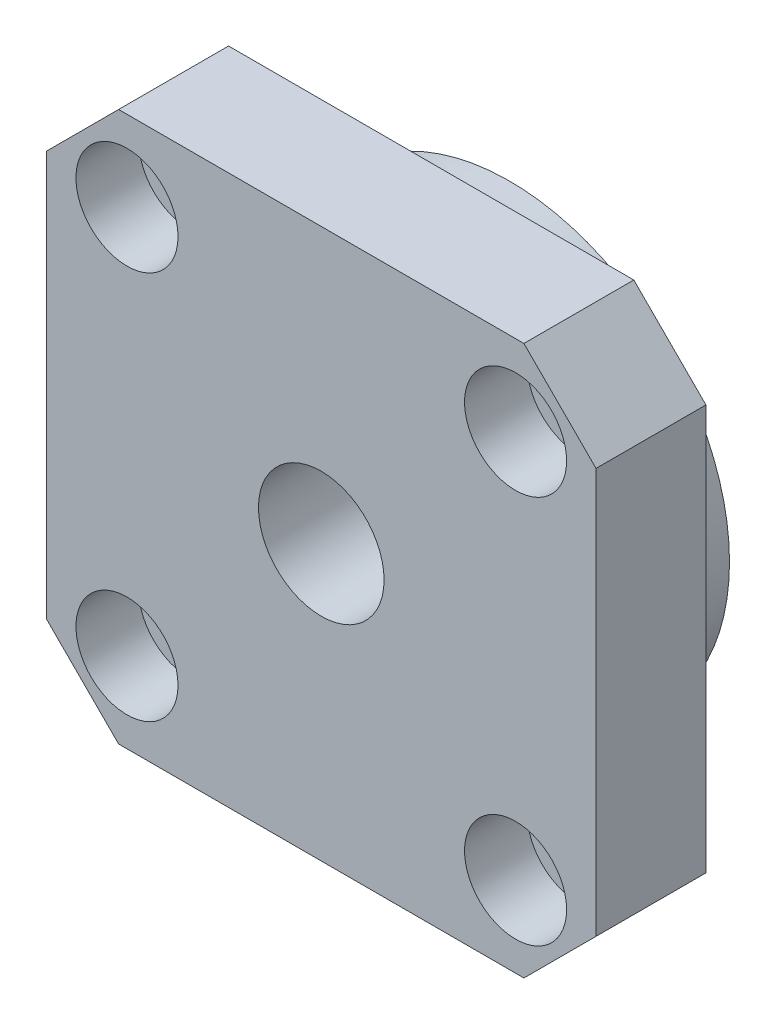
ISO-10303-21;
HEADER;
FILE_DESCRIPTION(('STEP AP214'),'2;1');
FILE_NAME('part.step','',(''),(''),'','','');
FILE_SCHEMA(('AUTOMOTIVE_DESIGN { 1 0 10303 214 1 1 1 1 }'));
ENDSEC;
DATA;
#1=APPLICATION_CONTEXT('core data for automotive mechanical design processes');
#2=APPLICATION_PROTOCOL_DEFINITION('international standard','automotive_design',2000,#1);
#3=PRODUCT_CONTEXT('',#1,'mechanical');
#4=PRODUCT('Part','Part','',(#3));
#5=PRODUCT_RELATED_PRODUCT_CATEGORY('part','',(#4));
#6=PRODUCT_DEFINITION_FORMATION('','',#4);
#7=PRODUCT_DEFINITION_CONTEXT('part definition',#1,'design');
#8=PRODUCT_DEFINITION('design','',#6,#7);
#9=PRODUCT_DEFINITION_SHAPE('','',#8);
#10=(LENGTH_UNIT() NAMED_UNIT(*) SI_UNIT(.MILLI.,.METRE.));
#11=(NAMED_UNIT(*) PLANE_ANGLE_UNIT() SI_UNIT($,.RADIAN.));
#12=(NAMED_UNIT(*) SI_UNIT($,.STERADIAN.) SOLID_ANGLE_UNIT());
#13=UNCERTAINTY_MEASURE_WITH_UNIT(LENGTH_MEASURE(1.E-05),#10,'distance_accuracy_value','');
#14=(GEOMETRIC_REPRESENTATION_CONTEXT(3) GLOBAL_UNCERTAINTY_ASSIGNED_CONTEXT((#13)) GLOBAL_UNIT_ASSIGNED_CONTEXT((#10,
#11,#12)) REPRESENTATION_CONTEXT('',''));
#15=CARTESIAN_POINT('',(0.,0.,0.));
#16=DIRECTION('',(0.,0.,1.));
#17=DIRECTION('',(1.,0.,0.));
#18=AXIS2_PLACEMENT_3D('',#15,#16,#17);
#19=CARTESIAN_POINT('',(0.,0.,5.));
#20=DIRECTION('',(0.,0.,-1.));
#21=DIRECTION('',(-1.,0.,0.));
#22=AXIS2_PLACEMENT_3D('',#19,#20,#21);
#23=CYLINDRICAL_SURFACE('',#22,4.);
#24=CARTESIAN_POINT('',(0.,0.,12.));
#25=DIRECTION('',(0.,0.,1.));
#26=DIRECTION('',(1.,0.,0.));
#27=AXIS2_PLACEMENT_3D('',#24,#25,#26);
#28=CIRCLE('',#27,4.);
#29=CARTESIAN_POINT('',(4.,0.,12.));
#30=VERTEX_POINT('',#29);
#31=EDGE_CURVE('E148',#30,#30,#28,.T.);
#32=ORIENTED_EDGE('',*,*,#31,.T.);
#33=EDGE_LOOP('',(#32));
#34=FACE_BOUND('',#33,.T.);
#35=CARTESIAN_POINT('',(0.,0.,5.));
#36=DIRECTION('',(0.,0.,-1.));
#37=DIRECTION('',(-1.,0.,0.));
#38=AXIS2_PLACEMENT_3D('',#35,#36,#37);
#39=CIRCLE('',#38,4.);
#40=CARTESIAN_POINT('',(-4.,0.,5.));
#41=VERTEX_POINT('',#40);
#42=EDGE_CURVE('E47',#41,#41,#39,.T.);
#43=ORIENTED_EDGE('',*,*,#42,.T.);
#44=EDGE_LOOP('',(#43));
#45=FACE_BOUND('',#44,.T.);
#46=ADVANCED_FACE('F43',(#34,#45),#23,.F.);
#47=CARTESIAN_POINT('',(-12.3743686707646,12.3743686707646,12.));
#48=DIRECTION('',(0.,0.,-1.));
#49=DIRECTION('',(-1.,0.,0.));
#50=AXIS2_PLACEMENT_3D('',#47,#48,#49);
#51=CYLINDRICAL_SURFACE('',#50,1.7);
#52=CARTESIAN_POINT('',(-12.3743686707646,12.3743686707646,5.));
#53=DIRECTION('',(0.,0.,1.));
#54=DIRECTION('',(1.,0.,0.));
#55=AXIS2_PLACEMENT_3D('',#52,#53,#54);
#56=CIRCLE('',#55,1.7);
#57=CARTESIAN_POINT('',(-10.6743686707646,12.3743686707646,5.));
#58=VERTEX_POINT('',#57);
#59=EDGE_CURVE('E204',#58,#58,#56,.T.);
#60=ORIENTED_EDGE('',*,*,#59,.F.);
#61=EDGE_LOOP('',(#60));
#62=FACE_BOUND('',#61,.T.);
#63=CARTESIAN_POINT('',(-12.3743686707646,12.3743686707646,8.));
#64=DIRECTION('',(0.,0.,1.));
#65=DIRECTION('',(1.,0.,0.));
#66=AXIS2_PLACEMENT_3D('',#63,#64,#65);
#67=CIRCLE('',#66,1.7);
#68=CARTESIAN_POINT('',(-10.6743686707646,12.3743686707646,8.));
#69=VERTEX_POINT('',#68);
#70=EDGE_CURVE('E185',#69,#69,#67,.T.);
#71=ORIENTED_EDGE('',*,*,#70,.T.);
#72=EDGE_LOOP('',(#71));
#73=FACE_BOUND('',#72,.T.);
#74=ADVANCED_FACE('F248',(#62,#73),#51,.F.);
#75=CARTESIAN_POINT('',(12.3743686707646,12.3743686707646,12.));
#76=DIRECTION('',(0.,0.,-1.));
#77=DIRECTION('',(-1.,0.,0.));
#78=AXIS2_PLACEMENT_3D('',#75,#76,#77);
#79=CYLINDRICAL_SURFACE('',#78,1.7);
#80=CARTESIAN_POINT('',(12.3743686707646,12.3743686707646,5.));
#81=DIRECTION('',(0.,0.,1.));
#82=DIRECTION('',(1.,0.,0.));
#83=AXIS2_PLACEMENT_3D('',#80,#81,#82);
#84=CIRCLE('',#83,1.7);
#85=CARTESIAN_POINT('',(14.0743686707646,12.3743686707646,5.));
#86=VERTEX_POINT('',#85);
#87=EDGE_CURVE('E196',#86,#86,#84,.T.);
#88=ORIENTED_EDGE('',*,*,#87,.F.);
#89=EDGE_LOOP('',(#88));
#90=FACE_BOUND('',#89,.T.);
#91=CARTESIAN_POINT('',(12.3743686707646,12.3743686707646,8.));
#92=DIRECTION('',(0.,0.,1.));
#93=DIRECTION('',(1.,0.,0.));
#94=AXIS2_PLACEMENT_3D('',#91,#92,#93);
#95=CIRCLE('',#94,1.7);
#96=CARTESIAN_POINT('',(14.0743686707646,12.3743686707646,8.));
#97=VERTEX_POINT('',#96);
#98=EDGE_CURVE('E183',#97,#97,#95,.T.);
#99=ORIENTED_EDGE('',*,*,#98,.T.);
#100=EDGE_LOOP('',(#99));
#101=FACE_BOUND('',#100,.T.);
#102=ADVANCED_FACE('F255',(#90,#101),#79,.F.);
#103=CARTESIAN_POINT('',(12.3743686707646,-12.3743686707646,12.));
#104=DIRECTION('',(0.,0.,-1.));
#105=DIRECTION('',(-1.,0.,0.));
#106=AXIS2_PLACEMENT_3D('',#103,#104,#105);
#107=CYLINDRICAL_SURFACE('',#106,1.7);
#108=CARTESIAN_POINT('',(12.3743686707646,-12.3743686707646,5.));
#109=DIRECTION('',(0.,0.,1.));
#110=DIRECTION('',(1.,0.,0.));
#111=AXIS2_PLACEMENT_3D('',#108,#109,#110);
#112=CIRCLE('',#111,1.7);
#113=CARTESIAN_POINT('',(14.0743686707646,-12.3743686707646,5.));
#114=VERTEX_POINT('',#113);
#115=EDGE_CURVE('E191',#114,#114,#112,.T.);
#116=ORIENTED_EDGE('',*,*,#115,.F.);
#117=EDGE_LOOP('',(#116));
#118=FACE_BOUND('',#117,.T.);
#119=CARTESIAN_POINT('',(12.3743686707646,-12.3743686707646,8.));
#120=DIRECTION('',(0.,0.,1.));
#121=DIRECTION('',(1.,0.,0.));
#122=AXIS2_PLACEMENT_3D('',#119,#120,#121);
#123=CIRCLE('',#122,1.7);
#124=CARTESIAN_POINT('',(14.0743686707646,-12.3743686707646,8.));
#125=VERTEX_POINT('',#124);
#126=EDGE_CURVE('E179',#125,#125,#123,.T.);
#127=ORIENTED_EDGE('',*,*,#126,.T.);
#128=EDGE_LOOP('',(#127));
#129=FACE_BOUND('',#128,.T.);
#130=ADVANCED_FACE('F270',(#118,#129),#107,.F.);
#131=CARTESIAN_POINT('',(-12.3743686707646,-12.3743686707646,12.));
#132=DIRECTION('',(0.,0.,-1.));
#133=DIRECTION('',(-1.,0.,0.));
#134=AXIS2_PLACEMENT_3D('',#131,#132,#133);
#135=CYLINDRICAL_SURFACE('',#134,1.7);
#136=CARTESIAN_POINT('',(-12.3743686707646,-12.3743686707646,5.));
#137=DIRECTION('',(0.,0.,1.));
#138=DIRECTION('',(1.,0.,0.));
#139=AXIS2_PLACEMENT_3D('',#136,#137,#138);
#140=CIRCLE('',#139,1.7);
#141=CARTESIAN_POINT('',(-10.6743686707646,-12.3743686707646,5.));
#142=VERTEX_POINT('',#141);
#143=EDGE_CURVE('E187',#142,#142,#140,.T.);
#144=ORIENTED_EDGE('',*,*,#143,.F.);
#145=EDGE_LOOP('',(#144));
#146=FACE_BOUND('',#145,.T.);
#147=CARTESIAN_POINT('',(-12.3743686707646,-12.3743686707646,8.));
#148=DIRECTION('',(0.,0.,1.));
#149=DIRECTION('',(1.,0.,0.));
#150=AXIS2_PLACEMENT_3D('',#147,#148,#149);
#151=CIRCLE('',#150,1.7);
#152=CARTESIAN_POINT('',(-10.6743686707646,-12.3743686707646,8.));
#153=VERTEX_POINT('',#152);
#154=EDGE_CURVE('E176',#153,#153,#151,.T.);
#155=ORIENTED_EDGE('',*,*,#154,.T.);
#156=EDGE_LOOP('',(#155));
#157=FACE_BOUND('',#156,.T.);
#158=ADVANCED_FACE('F262',(#146,#157),#135,.F.);
#159=CARTESIAN_POINT('',(0.,0.,0.));
#160=DIRECTION('',(0.,0.,1.));
#161=DIRECTION('',(1.,0.,0.));
#162=AXIS2_PLACEMENT_3D('',#159,#160,#161);
#163=PLANE('',#162);
#164=CARTESIAN_POINT('',(0.,0.,0.));
#165=DIRECTION('',(0.,0.,-1.));
#166=DIRECTION('',(-1.,0.,0.));
#167=AXIS2_PLACEMENT_3D('',#164,#165,#166);
#168=CIRCLE('',#167,10.);
#169=CARTESIAN_POINT('',(-10.,0.,0.));
#170=VERTEX_POINT('',#169);
#171=EDGE_CURVE('E276',#170,#170,#168,.T.);
#172=ORIENTED_EDGE('',*,*,#171,.F.);
#173=EDGE_LOOP('',(#172));
#174=FACE_BOUND('',#173,.T.);
#175=CARTESIAN_POINT('',(0.,0.,0.));
#176=DIRECTION('',(0.,0.,1.));
#177=DIRECTION('',(1.,0.,0.));
#178=AXIS2_PLACEMENT_3D('',#175,#176,#177);
#179=CIRCLE('',#178,14.);
#180=CARTESIAN_POINT('',(14.,0.,0.));
#181=VERTEX_POINT('',#180);
#182=EDGE_CURVE('E53',#181,#181,#179,.T.);
#183=ORIENTED_EDGE('',*,*,#182,.F.);
#184=EDGE_LOOP('',(#183));
#185=FACE_BOUND('',#184,.T.);
#186=ADVANCED_FACE('F261',(#174,#185),#163,.F.);
#187=CARTESIAN_POINT('',(0.,0.,5.));
#188=DIRECTION('',(0.,0.,-1.));
#189=DIRECTION('',(-1.,0.,0.));
#190=AXIS2_PLACEMENT_3D('',#187,#188,#189);
#191=CYLINDRICAL_SURFACE('',#190,14.);
#192=CARTESIAN_POINT('',(0.,0.,5.));
#193=DIRECTION('',(0.,0.,1.));
#194=DIRECTION('',(1.,0.,0.));
#195=AXIS2_PLACEMENT_3D('',#192,#193,#194);
#196=CIRCLE('',#195,14.);
#197=CARTESIAN_POINT('',(14.,0.,5.));
#198=VERTEX_POINT('',#197);
#199=EDGE_CURVE('E11',#198,#198,#196,.T.);
#200=ORIENTED_EDGE('',*,*,#199,.F.);
#201=EDGE_LOOP('',(#200));
#202=FACE_BOUND('',#201,.T.);
#203=ORIENTED_EDGE('',*,*,#182,.T.);
#204=EDGE_LOOP('',(#203));
#205=FACE_BOUND('',#204,.T.);
#206=ADVANCED_FACE('F45',(#202,#205),#191,.T.);
#207=CARTESIAN_POINT('',(0.,0.,12.));
#208=DIRECTION('',(0.,0.,-1.));
#209=DIRECTION('',(-1.,0.,0.));
#210=AXIS2_PLACEMENT_3D('',#207,#208,#209);
#211=PLANE('',#210);
#212=CARTESIAN_POINT('',(-12.3743686707646,-12.3743686707646,12.));
#213=DIRECTION('',(0.,0.,1.));
#214=DIRECTION('',(1.,0.,0.));
#215=AXIS2_PLACEMENT_3D('',#212,#213,#214);
#216=CIRCLE('',#215,3.25);
#217=CARTESIAN_POINT('',(-9.12436867076458,-12.3743686707646,12.));
#218=VERTEX_POINT('',#217);
#219=EDGE_CURVE('E297',#218,#218,#216,.T.);
#220=ORIENTED_EDGE('',*,*,#219,.F.);
#221=EDGE_LOOP('',(#220));
#222=FACE_BOUND('',#221,.T.);
#223=CARTESIAN_POINT('',(12.3743686707646,-12.3743686707646,12.));
#224=DIRECTION('',(0.,0.,1.));
#225=DIRECTION('',(1.,0.,0.));
#226=AXIS2_PLACEMENT_3D('',#223,#224,#225);
#227=CIRCLE('',#226,3.25);
#228=CARTESIAN_POINT('',(15.6243686707646,-12.3743686707646,12.));
#229=VERTEX_POINT('',#228);
#230=EDGE_CURVE('E291',#229,#229,#227,.T.);
#231=ORIENTED_EDGE('',*,*,#230,.F.);
#232=EDGE_LOOP('',(#231));
#233=FACE_BOUND('',#232,.T.);
#234=CARTESIAN_POINT('',(12.3743686707646,12.3743686707646,12.));
#235=DIRECTION('',(0.,0.,1.));
#236=DIRECTION('',(1.,0.,0.));
#237=AXIS2_PLACEMENT_3D('',#234,#235,#236);
#238=CIRCLE('',#237,3.25);
#239=CARTESIAN_POINT('',(15.6243686707646,12.3743686707646,12.));
#240=VERTEX_POINT('',#239);
#241=EDGE_CURVE('E285',#240,#240,#238,.T.);
#242=ORIENTED_EDGE('',*,*,#241,.F.);
#243=EDGE_LOOP('',(#242));
#244=FACE_BOUND('',#243,.T.);
#245=CARTESIAN_POINT('',(-12.3743686707646,12.3743686707646,12.));
#246=DIRECTION('',(0.,0.,1.));
#247=DIRECTION('',(1.,0.,0.));
#248=AXIS2_PLACEMENT_3D('',#245,#246,#247);
#249=CIRCLE('',#248,3.25);
#250=CARTESIAN_POINT('',(-9.12436867076459,12.3743686707646,12.));
#251=VERTEX_POINT('',#250);
#252=EDGE_CURVE('E199',#251,#251,#249,.T.);
#253=ORIENTED_EDGE('',*,*,#252,.F.);
#254=EDGE_LOOP('',(#253));
#255=FACE_BOUND('',#254,.T.);
#256=DIRECTION('',(-1.,0.,0.));
#257=VECTOR('',#256,1.);
#258=CARTESIAN_POINT('',(-12.9055915910215,17.5,12.));
#259=LINE('',#258,#257);
#260=CARTESIAN_POINT('',(12.9055915910215,17.5,12.));
#261=VERTEX_POINT('',#260);
#262=CARTESIAN_POINT('',(-12.9055915910215,17.5,12.));
#263=VERTEX_POINT('',#262);
#264=EDGE_CURVE('E159',#261,#263,#259,.T.);
#265=ORIENTED_EDGE('',*,*,#264,.T.);
#266=DIRECTION('',(-0.707106781186548,-0.707106781186547,0.));
#267=VECTOR('',#266,1.);
#268=CARTESIAN_POINT('',(-17.5,12.9055915910215,12.));
#269=LINE('',#268,#267);
#270=CARTESIAN_POINT('',(-17.5,12.9055915910215,12.));
#271=VERTEX_POINT('',#270);
#272=EDGE_CURVE('E106',#263,#271,#269,.T.);
#273=ORIENTED_EDGE('',*,*,#272,.T.);
#274=DIRECTION('',(0.,-1.,0.));
#275=VECTOR('',#274,1.);
#276=CARTESIAN_POINT('',(-17.5,12.9055915910215,12.));
#277=LINE('',#276,#275);
#278=CARTESIAN_POINT('',(-17.5,-12.9055915910216,12.));
#279=VERTEX_POINT('',#278);
#280=EDGE_CURVE('E211',#271,#279,#277,.T.);
#281=ORIENTED_EDGE('',*,*,#280,.T.);
#282=DIRECTION('',(0.707106781186548,-0.707106781186547,0.));
#283=VECTOR('',#282,1.);
#284=CARTESIAN_POINT('',(-17.5,-12.9055915910216,12.));
#285=LINE('',#284,#283);
#286=CARTESIAN_POINT('',(-12.9055915910215,-17.5,12.));
#287=VERTEX_POINT('',#286);
#288=EDGE_CURVE('E213',#279,#287,#285,.T.);
#289=ORIENTED_EDGE('',*,*,#288,.T.);
#290=DIRECTION('',(1.,0.,0.));
#291=VECTOR('',#290,1.);
#292=CARTESIAN_POINT('',(-12.9055915910215,-17.5,12.));
#293=LINE('',#292,#291);
#294=CARTESIAN_POINT('',(12.9055915910215,-17.5,12.));
#295=VERTEX_POINT('',#294);
#296=EDGE_CURVE('E126',#287,#295,#293,.T.);
#297=ORIENTED_EDGE('',*,*,#296,.T.);
#298=DIRECTION('',(0.707106781186547,0.707106781186548,0.));
#299=VECTOR('',#298,1.);
#300=CARTESIAN_POINT('',(12.9055915910215,-17.5,12.));
#301=LINE('',#300,#299);
#302=CARTESIAN_POINT('',(17.5,-12.9055915910216,12.));
#303=VERTEX_POINT('',#302);
#304=EDGE_CURVE('E119',#295,#303,#301,.T.);
#305=ORIENTED_EDGE('',*,*,#304,.T.);
#306=DIRECTION('',(0.,1.,0.));
#307=VECTOR('',#306,1.);
#308=CARTESIAN_POINT('',(17.5,12.9055915910215,12.));
#309=LINE('',#308,#307);
#310=CARTESIAN_POINT('',(17.5,12.9055915910215,12.));
#311=VERTEX_POINT('',#310);
#312=EDGE_CURVE('E124',#303,#311,#309,.T.);
#313=ORIENTED_EDGE('',*,*,#312,.T.);
#314=DIRECTION('',(-0.707106781186548,0.707106781186547,0.));
#315=VECTOR('',#314,1.);
#316=CARTESIAN_POINT('',(12.9055915910215,17.5,12.));
#317=LINE('',#316,#315);
#318=EDGE_CURVE('E62',#311,#261,#317,.T.);
#319=ORIENTED_EDGE('',*,*,#318,.T.);
#320=EDGE_LOOP('',(#265,#273,#281,#289,#297,#305,#313,#319));
#321=FACE_BOUND('',#320,.T.);
#322=ORIENTED_EDGE('',*,*,#31,.F.);
#323=EDGE_LOOP('',(#322));
#324=FACE_BOUND('',#323,.T.);
#325=ADVANCED_FACE('F121',(#222,#233,#244,#255,#321,#324),#211,.F.);
#326=CARTESIAN_POINT('',(0.,0.,5.));
#327=DIRECTION('',(0.,0.,-1.));
#328=DIRECTION('',(-1.,0.,0.));
#329=AXIS2_PLACEMENT_3D('',#326,#327,#328);
#330=PLANE('',#329);
#331=ORIENTED_EDGE('',*,*,#199,.T.);
#332=EDGE_LOOP('',(#331));
#333=FACE_BOUND('',#332,.T.);
#334=ORIENTED_EDGE('',*,*,#115,.T.);
#335=EDGE_LOOP('',(#334));
#336=FACE_BOUND('',#335,.T.);
#337=ORIENTED_EDGE('',*,*,#59,.T.);
#338=EDGE_LOOP('',(#337));
#339=FACE_BOUND('',#338,.T.);
#340=DIRECTION('',(-1.,0.,0.));
#341=VECTOR('',#340,1.);
#342=CARTESIAN_POINT('',(-12.9055915910215,17.5,5.));
#343=LINE('',#342,#341);
#344=CARTESIAN_POINT('',(12.9055915910215,17.5,5.));
#345=VERTEX_POINT('',#344);
#346=CARTESIAN_POINT('',(-12.9055915910215,17.5,5.));
#347=VERTEX_POINT('',#346);
#348=EDGE_CURVE('E144',#345,#347,#343,.T.);
#349=ORIENTED_EDGE('',*,*,#348,.F.);
#350=DIRECTION('',(-0.707106781186548,0.707106781186547,0.));
#351=VECTOR('',#350,1.);
#352=CARTESIAN_POINT('',(12.9055915910215,17.5,5.));
#353=LINE('',#352,#351);
#354=CARTESIAN_POINT('',(17.5,12.9055915910215,5.));
#355=VERTEX_POINT('',#354);
#356=EDGE_CURVE('E97',#355,#345,#353,.T.);
#357=ORIENTED_EDGE('',*,*,#356,.F.);
#358=DIRECTION('',(0.,1.,0.));
#359=VECTOR('',#358,1.);
#360=CARTESIAN_POINT('',(17.5,12.9055915910215,5.));
#361=LINE('',#360,#359);
#362=CARTESIAN_POINT('',(17.5,-12.9055915910216,5.));
#363=VERTEX_POINT('',#362);
#364=EDGE_CURVE('E91',#363,#355,#361,.T.);
#365=ORIENTED_EDGE('',*,*,#364,.F.);
#366=DIRECTION('',(0.707106781186547,0.707106781186548,0.));
#367=VECTOR('',#366,1.);
#368=CARTESIAN_POINT('',(12.9055915910215,-17.5,5.));
#369=LINE('',#368,#367);
#370=CARTESIAN_POINT('',(12.9055915910215,-17.5,5.));
#371=VERTEX_POINT('',#370);
#372=EDGE_CURVE('E134',#371,#363,#369,.T.);
#373=ORIENTED_EDGE('',*,*,#372,.F.);
#374=DIRECTION('',(1.,0.,0.));
#375=VECTOR('',#374,1.);
#376=CARTESIAN_POINT('',(-12.9055915910215,-17.5,5.));
#377=LINE('',#376,#375);
#378=CARTESIAN_POINT('',(-12.9055915910215,-17.5,5.));
#379=VERTEX_POINT('',#378);
#380=EDGE_CURVE('E154',#379,#371,#377,.T.);
#381=ORIENTED_EDGE('',*,*,#380,.F.);
#382=DIRECTION('',(0.707106781186548,-0.707106781186547,0.));
#383=VECTOR('',#382,1.);
#384=CARTESIAN_POINT('',(-17.5,-12.9055915910216,5.));
#385=LINE('',#384,#383);
#386=CARTESIAN_POINT('',(-17.5,-12.9055915910216,5.));
#387=VERTEX_POINT('',#386);
#388=EDGE_CURVE('E152',#387,#379,#385,.T.);
#389=ORIENTED_EDGE('',*,*,#388,.F.);
#390=DIRECTION('',(0.,-1.,0.));
#391=VECTOR('',#390,1.);
#392=CARTESIAN_POINT('',(-17.5,12.9055915910215,5.));
#393=LINE('',#392,#391);
#394=CARTESIAN_POINT('',(-17.5,12.9055915910215,5.));
#395=VERTEX_POINT('',#394);
#396=EDGE_CURVE('E150',#395,#387,#393,.T.);
#397=ORIENTED_EDGE('',*,*,#396,.F.);
#398=DIRECTION('',(-0.707106781186548,-0.707106781186547,0.));
#399=VECTOR('',#398,1.);
#400=CARTESIAN_POINT('',(-17.5,12.9055915910215,5.));
#401=LINE('',#400,#399);
#402=EDGE_CURVE('E147',#347,#395,#401,.T.);
#403=ORIENTED_EDGE('',*,*,#402,.F.);
#404=EDGE_LOOP('',(#349,#357,#365,#373,#381,#389,#397,#403));
#405=FACE_BOUND('',#404,.T.);
#406=ORIENTED_EDGE('',*,*,#87,.T.);
#407=EDGE_LOOP('',(#406));
#408=FACE_BOUND('',#407,.T.);
#409=ORIENTED_EDGE('',*,*,#143,.T.);
#410=EDGE_LOOP('',(#409));
#411=FACE_BOUND('',#410,.T.);
#412=ADVANCED_FACE('F226',(#333,#336,#339,#405,#408,#411),#330,.T.);
#413=CARTESIAN_POINT('',(-12.9055915910215,17.5,12.));
#414=DIRECTION('',(0.,-1.,0.));
#415=DIRECTION('',(0.,0.,-1.));
#416=AXIS2_PLACEMENT_3D('',#413,#414,#415);
#417=PLANE('',#416);
#418=ORIENTED_EDGE('',*,*,#348,.T.);
#419=DIRECTION('',(0.,0.,-1.));
#420=VECTOR('',#419,1.);
#421=CARTESIAN_POINT('',(-12.9055915910215,17.5,12.));
#422=LINE('',#421,#420);
#423=EDGE_CURVE('E172',#263,#347,#422,.T.);
#424=ORIENTED_EDGE('',*,*,#423,.F.);
#425=ORIENTED_EDGE('',*,*,#264,.F.);
#426=DIRECTION('',(0.,0.,-1.));
#427=VECTOR('',#426,1.);
#428=CARTESIAN_POINT('',(12.9055915910215,17.5,12.));
#429=LINE('',#428,#427);
#430=EDGE_CURVE('E140',#261,#345,#429,.T.);
#431=ORIENTED_EDGE('',*,*,#430,.T.);
#432=EDGE_LOOP('',(#418,#424,#425,#431));
#433=FACE_BOUND('',#432,.T.);
#434=ADVANCED_FACE('F231',(#433),#417,.F.);
#435=CARTESIAN_POINT('',(-17.5,12.9055915910215,12.));
#436=DIRECTION('',(0.707106781186547,-0.707106781186548,0.));
#437=DIRECTION('',(0.707106781186548,0.707106781186547,0.));
#438=AXIS2_PLACEMENT_3D('',#435,#436,#437);
#439=PLANE('',#438);
#440=ORIENTED_EDGE('',*,*,#402,.T.);
#441=DIRECTION('',(0.,0.,-1.));
#442=VECTOR('',#441,1.);
#443=CARTESIAN_POINT('',(-17.5,12.9055915910215,12.));
#444=LINE('',#443,#442);
#445=EDGE_CURVE('E169',#271,#395,#444,.T.);
#446=ORIENTED_EDGE('',*,*,#445,.F.);
#447=ORIENTED_EDGE('',*,*,#272,.F.);
#448=ORIENTED_EDGE('',*,*,#423,.T.);
#449=EDGE_LOOP('',(#440,#446,#447,#448));
#450=FACE_BOUND('',#449,.T.);
#451=ADVANCED_FACE('F479',(#450),#439,.F.);
#452=CARTESIAN_POINT('',(-17.5,12.9055915910215,12.));
#453=DIRECTION('',(1.,0.,0.));
#454=DIRECTION('',(0.,0.,-1.));
#455=AXIS2_PLACEMENT_3D('',#452,#453,#454);
#456=PLANE('',#455);
#457=ORIENTED_EDGE('',*,*,#396,.T.);
#458=DIRECTION('',(0.,0.,-1.));
#459=VECTOR('',#458,1.);
#460=CARTESIAN_POINT('',(-17.5,-12.9055915910216,12.));
#461=LINE('',#460,#459);
#462=EDGE_CURVE('E166',#279,#387,#461,.T.);
#463=ORIENTED_EDGE('',*,*,#462,.F.);
#464=ORIENTED_EDGE('',*,*,#280,.F.);
#465=ORIENTED_EDGE('',*,*,#445,.T.);
#466=EDGE_LOOP('',(#457,#463,#464,#465));
#467=FACE_BOUND('',#466,.T.);
#468=ADVANCED_FACE('F471',(#467),#456,.F.);
#469=CARTESIAN_POINT('',(-17.5,-12.9055915910216,12.));
#470=DIRECTION('',(0.707106781186547,0.707106781186548,0.));
#471=DIRECTION('',(-0.707106781186548,0.707106781186547,0.));
#472=AXIS2_PLACEMENT_3D('',#469,#470,#471);
#473=PLANE('',#472);
#474=ORIENTED_EDGE('',*,*,#388,.T.);
#475=DIRECTION('',(0.,0.,-1.));
#476=VECTOR('',#475,1.);
#477=CARTESIAN_POINT('',(-12.9055915910215,-17.5,12.));
#478=LINE('',#477,#476);
#479=EDGE_CURVE('E163',#287,#379,#478,.T.);
#480=ORIENTED_EDGE('',*,*,#479,.F.);
#481=ORIENTED_EDGE('',*,*,#288,.F.);
#482=ORIENTED_EDGE('',*,*,#462,.T.);
#483=EDGE_LOOP('',(#474,#480,#481,#482));
#484=FACE_BOUND('',#483,.T.);
#485=ADVANCED_FACE('F219',(#484),#473,.F.);
#486=CARTESIAN_POINT('',(-12.9055915910215,-17.5,12.));
#487=DIRECTION('',(0.,1.,0.));
#488=DIRECTION('',(0.,0.,1.));
#489=AXIS2_PLACEMENT_3D('',#486,#487,#488);
#490=PLANE('',#489);
#491=ORIENTED_EDGE('',*,*,#380,.T.);
#492=DIRECTION('',(0.,0.,-1.));
#493=VECTOR('',#492,1.);
#494=CARTESIAN_POINT('',(12.9055915910215,-17.5,12.));
#495=LINE('',#494,#493);
#496=EDGE_CURVE('E135',#295,#371,#495,.T.);
#497=ORIENTED_EDGE('',*,*,#496,.F.);
#498=ORIENTED_EDGE('',*,*,#296,.F.);
#499=ORIENTED_EDGE('',*,*,#479,.T.);
#500=EDGE_LOOP('',(#491,#497,#498,#499));
#501=FACE_BOUND('',#500,.T.);
#502=ADVANCED_FACE('F223',(#501),#490,.F.);
#503=CARTESIAN_POINT('',(12.9055915910215,-17.5,12.));
#504=DIRECTION('',(-0.707106781186548,0.707106781186547,0.));
#505=DIRECTION('',(-0.707106781186547,-0.707106781186548,0.));
#506=AXIS2_PLACEMENT_3D('',#503,#504,#505);
#507=PLANE('',#506);
#508=ORIENTED_EDGE('',*,*,#372,.T.);
#509=DIRECTION('',(0.,0.,-1.));
#510=VECTOR('',#509,1.);
#511=CARTESIAN_POINT('',(17.5,-12.9055915910216,12.));
#512=LINE('',#511,#510);
#513=EDGE_CURVE('E131',#303,#363,#512,.T.);
#514=ORIENTED_EDGE('',*,*,#513,.F.);
#515=ORIENTED_EDGE('',*,*,#304,.F.);
#516=ORIENTED_EDGE('',*,*,#496,.T.);
#517=EDGE_LOOP('',(#508,#514,#515,#516));
#518=FACE_BOUND('',#517,.T.);
#519=ADVANCED_FACE('F132',(#518),#507,.F.);
#520=CARTESIAN_POINT('',(17.5,12.9055915910215,12.));
#521=DIRECTION('',(-1.,0.,0.));
#522=DIRECTION('',(0.,0.,1.));
#523=AXIS2_PLACEMENT_3D('',#520,#521,#522);
#524=PLANE('',#523);
#525=ORIENTED_EDGE('',*,*,#364,.T.);
#526=DIRECTION('',(0.,0.,-1.));
#527=VECTOR('',#526,1.);
#528=CARTESIAN_POINT('',(17.5,12.9055915910215,12.));
#529=LINE('',#528,#527);
#530=EDGE_CURVE('E136',#311,#355,#529,.T.);
#531=ORIENTED_EDGE('',*,*,#530,.F.);
#532=ORIENTED_EDGE('',*,*,#312,.F.);
#533=ORIENTED_EDGE('',*,*,#513,.T.);
#534=EDGE_LOOP('',(#525,#531,#532,#533));
#535=FACE_BOUND('',#534,.T.);
#536=ADVANCED_FACE('F138',(#535),#524,.F.);
#537=CARTESIAN_POINT('',(12.9055915910215,17.5,12.));
#538=DIRECTION('',(-0.707106781186547,-0.707106781186548,0.));
#539=DIRECTION('',(0.707106781186548,-0.707106781186547,0.));
#540=AXIS2_PLACEMENT_3D('',#537,#538,#539);
#541=PLANE('',#540);
#542=ORIENTED_EDGE('',*,*,#356,.T.);
#543=ORIENTED_EDGE('',*,*,#430,.F.);
#544=ORIENTED_EDGE('',*,*,#318,.F.);
#545=ORIENTED_EDGE('',*,*,#530,.T.);
#546=EDGE_LOOP('',(#542,#543,#544,#545));
#547=FACE_BOUND('',#546,.T.);
#548=ADVANCED_FACE('F233',(#547),#541,.F.);
#549=CARTESIAN_POINT('',(-12.3743686707646,-12.3743686707646,8.));
#550=DIRECTION('',(0.,0.,1.));
#551=DIRECTION('',(1.,0.,0.));
#552=AXIS2_PLACEMENT_3D('',#549,#550,#551);
#553=CYLINDRICAL_SURFACE('',#552,3.25);
#554=CARTESIAN_POINT('',(-12.3743686707646,-12.3743686707646,8.));
#555=DIRECTION('',(0.,0.,1.));
#556=DIRECTION('',(1.,0.,0.));
#557=AXIS2_PLACEMENT_3D('',#554,#555,#556);
#558=CIRCLE('',#557,3.25);
#559=CARTESIAN_POINT('',(-9.12436867076458,-12.3743686707646,8.));
#560=VERTEX_POINT('',#559);
#561=EDGE_CURVE('E300',#560,#560,#558,.T.);
#562=ORIENTED_EDGE('',*,*,#561,.F.);
#563=EDGE_LOOP('',(#562));
#564=FACE_BOUND('',#563,.T.);
#565=ORIENTED_EDGE('',*,*,#219,.T.);
#566=EDGE_LOOP('',(#565));
#567=FACE_BOUND('',#566,.T.);
#568=ADVANCED_FACE('F235',(#564,#567),#553,.F.);
#569=CARTESIAN_POINT('',(-12.3743686707646,-12.3743686707646,8.));
#570=DIRECTION('',(0.,0.,1.));
#571=DIRECTION('',(1.,0.,0.));
#572=AXIS2_PLACEMENT_3D('',#569,#570,#571);
#573=PLANE('',#572);
#574=ORIENTED_EDGE('',*,*,#154,.F.);
#575=EDGE_LOOP('',(#574));
#576=FACE_BOUND('',#575,.T.);
#577=ORIENTED_EDGE('',*,*,#561,.T.);
#578=EDGE_LOOP('',(#577));
#579=FACE_BOUND('',#578,.T.);
#580=ADVANCED_FACE('F242',(#576,#579),#573,.T.);
#581=CARTESIAN_POINT('',(12.3743686707646,-12.3743686707646,8.));
#582=DIRECTION('',(0.,0.,1.));
#583=DIRECTION('',(1.,0.,0.));
#584=AXIS2_PLACEMENT_3D('',#581,#582,#583);
#585=CYLINDRICAL_SURFACE('',#584,3.25);
#586=CARTESIAN_POINT('',(12.3743686707646,-12.3743686707646,8.));
#587=DIRECTION('',(0.,0.,1.));
#588=DIRECTION('',(1.,0.,0.));
#589=AXIS2_PLACEMENT_3D('',#586,#587,#588);
#590=CIRCLE('',#589,3.25);
#591=CARTESIAN_POINT('',(15.6243686707646,-12.3743686707646,8.));
#592=VERTEX_POINT('',#591);
#593=EDGE_CURVE('E294',#592,#592,#590,.T.);
#594=ORIENTED_EDGE('',*,*,#593,.F.);
#595=EDGE_LOOP('',(#594));
#596=FACE_BOUND('',#595,.T.);
#597=ORIENTED_EDGE('',*,*,#230,.T.);
#598=EDGE_LOOP('',(#597));
#599=FACE_BOUND('',#598,.T.);
#600=ADVANCED_FACE('F335',(#596,#599),#585,.F.);
#601=CARTESIAN_POINT('',(12.3743686707646,-12.3743686707646,8.));
#602=DIRECTION('',(0.,0.,1.));
#603=DIRECTION('',(1.,0.,0.));
#604=AXIS2_PLACEMENT_3D('',#601,#602,#603);
#605=PLANE('',#604);
#606=ORIENTED_EDGE('',*,*,#126,.F.);
#607=EDGE_LOOP('',(#606));
#608=FACE_BOUND('',#607,.T.);
#609=ORIENTED_EDGE('',*,*,#593,.T.);
#610=EDGE_LOOP('',(#609));
#611=FACE_BOUND('',#610,.T.);
#612=ADVANCED_FACE('F338',(#608,#611),#605,.T.);
#613=CARTESIAN_POINT('',(12.3743686707646,12.3743686707646,8.));
#614=DIRECTION('',(0.,0.,1.));
#615=DIRECTION('',(1.,0.,0.));
#616=AXIS2_PLACEMENT_3D('',#613,#614,#615);
#617=CYLINDRICAL_SURFACE('',#616,3.25);
#618=CARTESIAN_POINT('',(12.3743686707646,12.3743686707646,8.));
#619=DIRECTION('',(0.,0.,1.));
#620=DIRECTION('',(1.,0.,0.));
#621=AXIS2_PLACEMENT_3D('',#618,#619,#620);
#622=CIRCLE('',#621,3.25);
#623=CARTESIAN_POINT('',(15.6243686707646,12.3743686707646,8.));
#624=VERTEX_POINT('',#623);
#625=EDGE_CURVE('E288',#624,#624,#622,.T.);
#626=ORIENTED_EDGE('',*,*,#625,.F.);
#627=EDGE_LOOP('',(#626));
#628=FACE_BOUND('',#627,.T.);
#629=ORIENTED_EDGE('',*,*,#241,.T.);
#630=EDGE_LOOP('',(#629));
#631=FACE_BOUND('',#630,.T.);
#632=ADVANCED_FACE('F341',(#628,#631),#617,.F.);
#633=CARTESIAN_POINT('',(12.3743686707646,12.3743686707646,8.));
#634=DIRECTION('',(0.,0.,1.));
#635=DIRECTION('',(1.,0.,0.));
#636=AXIS2_PLACEMENT_3D('',#633,#634,#635);
#637=PLANE('',#636);
#638=ORIENTED_EDGE('',*,*,#98,.F.);
#639=EDGE_LOOP('',(#638));
#640=FACE_BOUND('',#639,.T.);
#641=ORIENTED_EDGE('',*,*,#625,.T.);
#642=EDGE_LOOP('',(#641));
#643=FACE_BOUND('',#642,.T.);
#644=ADVANCED_FACE('F329',(#640,#643),#637,.T.);
#645=CARTESIAN_POINT('',(-12.3743686707646,12.3743686707646,8.));
#646=DIRECTION('',(0.,0.,1.));
#647=DIRECTION('',(1.,0.,0.));
#648=AXIS2_PLACEMENT_3D('',#645,#646,#647);
#649=CYLINDRICAL_SURFACE('',#648,3.25);
#650=CARTESIAN_POINT('',(-12.3743686707646,12.3743686707646,8.));
#651=DIRECTION('',(0.,0.,1.));
#652=DIRECTION('',(1.,0.,0.));
#653=AXIS2_PLACEMENT_3D('',#650,#651,#652);
#654=CIRCLE('',#653,3.25);
#655=CARTESIAN_POINT('',(-9.12436867076459,12.3743686707646,8.));
#656=VERTEX_POINT('',#655);
#657=EDGE_CURVE('E180',#656,#656,#654,.T.);
#658=ORIENTED_EDGE('',*,*,#657,.F.);
#659=EDGE_LOOP('',(#658));
#660=FACE_BOUND('',#659,.T.);
#661=ORIENTED_EDGE('',*,*,#252,.T.);
#662=EDGE_LOOP('',(#661));
#663=FACE_BOUND('',#662,.T.);
#664=ADVANCED_FACE('F308',(#660,#663),#649,.F.);
#665=CARTESIAN_POINT('',(-12.3743686707646,12.3743686707646,8.));
#666=DIRECTION('',(0.,0.,1.));
#667=DIRECTION('',(1.,0.,0.));
#668=AXIS2_PLACEMENT_3D('',#665,#666,#667);
#669=PLANE('',#668);
#670=ORIENTED_EDGE('',*,*,#70,.F.);
#671=EDGE_LOOP('',(#670));
#672=FACE_BOUND('',#671,.T.);
#673=ORIENTED_EDGE('',*,*,#657,.T.);
#674=EDGE_LOOP('',(#673));
#675=FACE_BOUND('',#674,.T.);
#676=ADVANCED_FACE('F328',(#672,#675),#669,.T.);
#677=CARTESIAN_POINT('',(0.,0.,5.));
#678=DIRECTION('',(0.,0.,-1.));
#679=DIRECTION('',(-1.,0.,0.));
#680=AXIS2_PLACEMENT_3D('',#677,#678,#679);
#681=CYLINDRICAL_SURFACE('',#680,10.);
#682=CARTESIAN_POINT('',(0.,0.,5.));
#683=DIRECTION('',(0.,0.,-1.));
#684=DIRECTION('',(-1.,0.,0.));
#685=AXIS2_PLACEMENT_3D('',#682,#683,#684);
#686=CIRCLE('',#685,10.);
#687=CARTESIAN_POINT('',(-10.,0.,5.));
#688=VERTEX_POINT('',#687);
#689=EDGE_CURVE('E280',#688,#688,#686,.T.);
#690=ORIENTED_EDGE('',*,*,#689,.F.);
#691=EDGE_LOOP('',(#690));
#692=FACE_BOUND('',#691,.T.);
#693=ORIENTED_EDGE('',*,*,#171,.T.);
#694=EDGE_LOOP('',(#693));
#695=FACE_BOUND('',#694,.T.);
#696=ADVANCED_FACE('F332',(#692,#695),#681,.F.);
#697=CARTESIAN_POINT('',(0.,0.,5.));
#698=DIRECTION('',(0.,0.,-1.));
#699=DIRECTION('',(-1.,0.,0.));
#700=AXIS2_PLACEMENT_3D('',#697,#698,#699);
#701=PLANE('',#700);
#702=ORIENTED_EDGE('',*,*,#42,.F.);
#703=EDGE_LOOP('',(#702));
#704=FACE_BOUND('',#703,.T.);
#705=ORIENTED_EDGE('',*,*,#689,.T.);
#706=EDGE_LOOP('',(#705));
#707=FACE_BOUND('',#706,.T.);
#708=ADVANCED_FACE('F353',(#704,#707),#701,.T.);
#709=CLOSED_SHELL('',(#46,#74,#102,#130,#158,#186,#206,#325,#412,#434,#451,#468,#485,#502,#519,
#536,#548,#568,#580,#600,#612,#632,#644,#664,#676,#696,#708));
#710=MANIFOLD_SOLID_BREP('B2',#709);
#711=ADVANCED_BREP_SHAPE_REPRESENTATION('',(#18,#710),#14);
#712=SHAPE_DEFINITION_REPRESENTATION(#9,#711);
ENDSEC;
END-ISO-10303-21;
